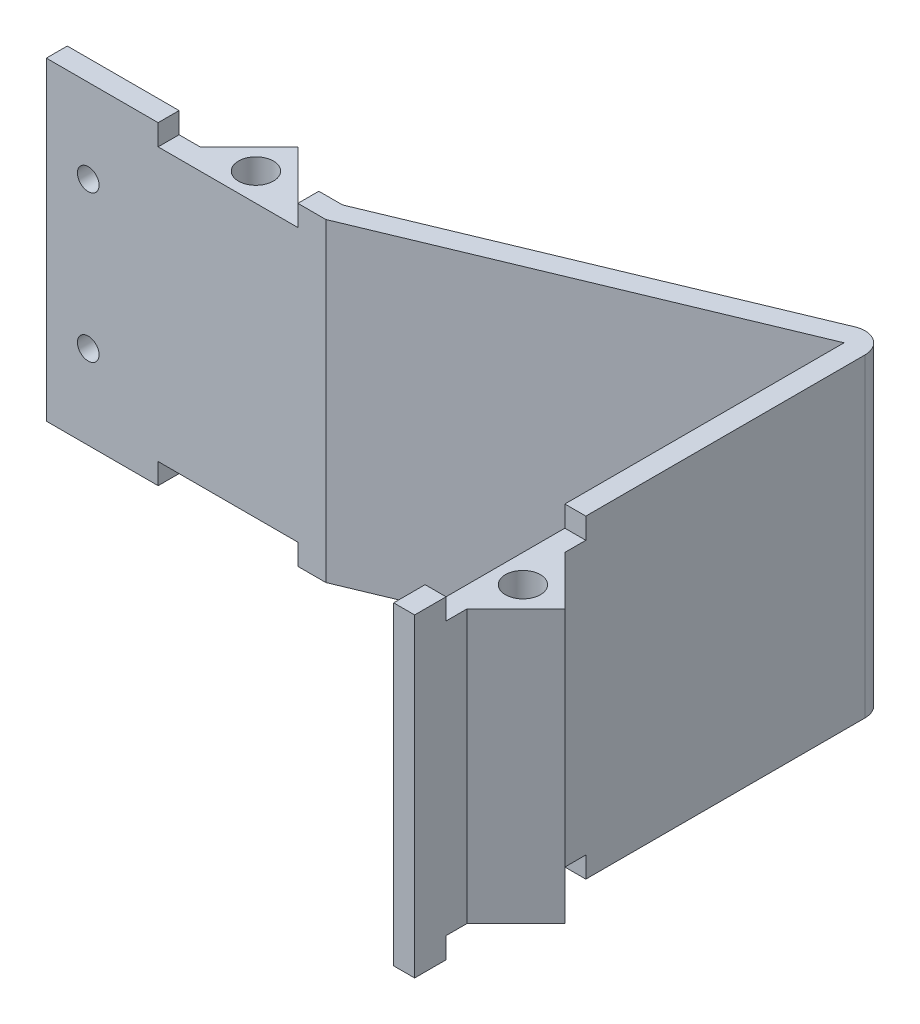
ISO-10303-21;
HEADER;
FILE_DESCRIPTION(('STEP AP214'),'2;1');
FILE_NAME('part.step','',(''),(''),'','','');
FILE_SCHEMA(('AUTOMOTIVE_DESIGN { 1 0 10303 214 1 1 1 1 }'));
ENDSEC;
DATA;
#1=APPLICATION_CONTEXT('core data for automotive mechanical design processes');
#2=APPLICATION_PROTOCOL_DEFINITION('international standard','automotive_design',2000,#1);
#3=PRODUCT_CONTEXT('',#1,'mechanical');
#4=PRODUCT('Part','Part','',(#3));
#5=PRODUCT_RELATED_PRODUCT_CATEGORY('part','',(#4));
#6=PRODUCT_DEFINITION_FORMATION('','',#4);
#7=PRODUCT_DEFINITION_CONTEXT('part definition',#1,'design');
#8=PRODUCT_DEFINITION('design','',#6,#7);
#9=PRODUCT_DEFINITION_SHAPE('','',#8);
#10=(LENGTH_UNIT() NAMED_UNIT(*) SI_UNIT(.MILLI.,.METRE.));
#11=(NAMED_UNIT(*) PLANE_ANGLE_UNIT() SI_UNIT($,.RADIAN.));
#12=(NAMED_UNIT(*) SI_UNIT($,.STERADIAN.) SOLID_ANGLE_UNIT());
#13=UNCERTAINTY_MEASURE_WITH_UNIT(LENGTH_MEASURE(1.E-05),#10,'distance_accuracy_value','');
#14=(GEOMETRIC_REPRESENTATION_CONTEXT(3) GLOBAL_UNCERTAINTY_ASSIGNED_CONTEXT((#13)) GLOBAL_UNIT_ASSIGNED_CONTEXT((#10,
#11,#12)) REPRESENTATION_CONTEXT('',''));
#15=CARTESIAN_POINT('',(0.,0.,0.));
#16=DIRECTION('',(0.,0.,1.));
#17=DIRECTION('',(1.,0.,0.));
#18=AXIS2_PLACEMENT_3D('',#15,#16,#17);
#19=CARTESIAN_POINT('',(95.37,0.,-18.8));
#20=DIRECTION('',(1.,0.,0.));
#21=DIRECTION('',(0.,0.,-1.));
#22=AXIS2_PLACEMENT_3D('',#19,#20,#21);
#23=PLANE('',#22);
#24=DIRECTION('',(0.,1.,0.));
#25=VECTOR('',#24,1.);
#26=CARTESIAN_POINT('',(95.37,0.,24.16));
#27=LINE('',#26,#25);
#28=CARTESIAN_POINT('',(95.37,3.,24.16));
#29=VERTEX_POINT('',#28);
#30=CARTESIAN_POINT('',(95.37,42.,24.16));
#31=VERTEX_POINT('',#30);
#32=EDGE_CURVE('E279',#29,#31,#27,.T.);
#33=ORIENTED_EDGE('',*,*,#32,.F.);
#34=DIRECTION('',(0.,0.,1.));
#35=VECTOR('',#34,1.);
#36=CARTESIAN_POINT('',(95.37,3.,41.16));
#37=LINE('',#36,#35);
#38=CARTESIAN_POINT('',(95.37,3.,21.16));
#39=VERTEX_POINT('',#38);
#40=EDGE_CURVE('E271',#39,#29,#37,.T.);
#41=ORIENTED_EDGE('',*,*,#40,.F.);
#42=DIRECTION('',(0.,1.,0.));
#43=VECTOR('',#42,1.);
#44=CARTESIAN_POINT('',(95.37,0.,21.16));
#45=LINE('',#44,#43);
#46=CARTESIAN_POINT('',(95.37,0.,21.16));
#47=VERTEX_POINT('',#46);
#48=EDGE_CURVE('E293',#47,#39,#45,.T.);
#49=ORIENTED_EDGE('',*,*,#48,.F.);
#50=DIRECTION('',(0.,0.,-1.));
#51=VECTOR('',#50,1.);
#52=CARTESIAN_POINT('',(95.37,0.,-18.8));
#53=LINE('',#52,#51);
#54=CARTESIAN_POINT('',(95.37,0.,-18.8));
#55=VERTEX_POINT('',#54);
#56=EDGE_CURVE('E341',#47,#55,#53,.T.);
#57=ORIENTED_EDGE('',*,*,#56,.T.);
#58=DIRECTION('',(0.,1.,0.));
#59=VECTOR('',#58,1.);
#60=CARTESIAN_POINT('',(95.37,0.,-18.8));
#61=LINE('',#60,#59);
#62=CARTESIAN_POINT('',(95.37,45.,-18.8));
#63=VERTEX_POINT('',#62);
#64=EDGE_CURVE('E361',#55,#63,#61,.T.);
#65=ORIENTED_EDGE('',*,*,#64,.T.);
#66=DIRECTION('',(0.,0.,-1.));
#67=VECTOR('',#66,1.);
#68=CARTESIAN_POINT('',(95.37,45.,-18.8));
#69=LINE('',#68,#67);
#70=CARTESIAN_POINT('',(95.37,45.,21.16));
#71=VERTEX_POINT('',#70);
#72=EDGE_CURVE('E354',#71,#63,#69,.T.);
#73=ORIENTED_EDGE('',*,*,#72,.F.);
#74=DIRECTION('',(0.,1.,0.));
#75=VECTOR('',#74,1.);
#76=CARTESIAN_POINT('',(95.37,45.,21.16));
#77=LINE('',#76,#75);
#78=CARTESIAN_POINT('',(95.37,42.,21.16));
#79=VERTEX_POINT('',#78);
#80=EDGE_CURVE('E313',#79,#71,#77,.T.);
#81=ORIENTED_EDGE('',*,*,#80,.F.);
#82=DIRECTION('',(0.,0.,-1.));
#83=VECTOR('',#82,1.);
#84=CARTESIAN_POINT('',(95.37,42.,41.16));
#85=LINE('',#84,#83);
#86=EDGE_CURVE('E321',#31,#79,#85,.T.);
#87=ORIENTED_EDGE('',*,*,#86,.F.);
#88=EDGE_LOOP('',(#33,#41,#49,#57,#65,#73,#81,#87));
#89=FACE_BOUND('',#88,.T.);
#90=ADVANCED_FACE('F50',(#89),#23,.T.);
#91=CARTESIAN_POINT('',(0.,0.,3.));
#92=DIRECTION('',(0.,1.,0.));
#93=DIRECTION('',(0.,0.,1.));
#94=AXIS2_PLACEMENT_3D('',#91,#92,#93);
#95=PLANE('',#94);
#96=DIRECTION('',(0.,0.,1.));
#97=VECTOR('',#96,1.);
#98=CARTESIAN_POINT('',(92.37,0.,-18.8));
#99=LINE('',#98,#97);
#100=CARTESIAN_POINT('',(92.37,0.,41.16));
#101=VERTEX_POINT('',#100);
#102=CARTESIAN_POINT('',(92.37,0.,45.66));
#103=VERTEX_POINT('',#102);
#104=EDGE_CURVE('E338',#101,#103,#99,.T.);
#105=ORIENTED_EDGE('',*,*,#104,.F.);
#106=DIRECTION('',(1.,0.,0.));
#107=VECTOR('',#106,1.);
#108=CARTESIAN_POINT('',(92.37,0.,41.16));
#109=LINE('',#108,#107);
#110=CARTESIAN_POINT('',(95.37,0.,41.16));
#111=VERTEX_POINT('',#110);
#112=EDGE_CURVE('E290',#101,#111,#109,.T.);
#113=ORIENTED_EDGE('',*,*,#112,.T.);
#114=CARTESIAN_POINT('',(95.37,0.,45.66));
#115=VERTEX_POINT('',#114);
#116=EDGE_CURVE('E342',#115,#111,#53,.T.);
#117=ORIENTED_EDGE('',*,*,#116,.F.);
#118=DIRECTION('',(1.,0.,0.));
#119=VECTOR('',#118,1.);
#120=CARTESIAN_POINT('',(92.37,0.,45.66));
#121=LINE('',#120,#119);
#122=EDGE_CURVE('E337',#103,#115,#121,.T.);
#123=ORIENTED_EDGE('',*,*,#122,.F.);
#124=EDGE_LOOP('',(#105,#113,#117,#123));
#125=FACE_BOUND('',#124,.T.);
#126=ADVANCED_FACE('F590',(#125),#95,.F.);
#127=CARTESIAN_POINT('',(0.,45.,3.));
#128=DIRECTION('',(0.,-1.,0.));
#129=DIRECTION('',(0.,0.,-1.));
#130=AXIS2_PLACEMENT_3D('',#127,#128,#129);
#131=PLANE('',#130);
#132=CARTESIAN_POINT('',(95.37,45.,45.66));
#133=VERTEX_POINT('',#132);
#134=CARTESIAN_POINT('',(95.37,45.,41.16));
#135=VERTEX_POINT('',#134);
#136=EDGE_CURVE('E355',#133,#135,#69,.T.);
#137=ORIENTED_EDGE('',*,*,#136,.T.);
#138=DIRECTION('',(1.,0.,0.));
#139=VECTOR('',#138,1.);
#140=CARTESIAN_POINT('',(92.37,45.,41.16));
#141=LINE('',#140,#139);
#142=CARTESIAN_POINT('',(92.37,45.,41.16));
#143=VERTEX_POINT('',#142);
#144=EDGE_CURVE('E294',#143,#135,#141,.T.);
#145=ORIENTED_EDGE('',*,*,#144,.F.);
#146=DIRECTION('',(0.,0.,1.));
#147=VECTOR('',#146,1.);
#148=CARTESIAN_POINT('',(92.37,45.,-18.8));
#149=LINE('',#148,#147);
#150=CARTESIAN_POINT('',(92.37,45.,45.66));
#151=VERTEX_POINT('',#150);
#152=EDGE_CURVE('E302',#143,#151,#149,.T.);
#153=ORIENTED_EDGE('',*,*,#152,.T.);
#154=DIRECTION('',(1.,0.,0.));
#155=VECTOR('',#154,1.);
#156=CARTESIAN_POINT('',(92.37,45.,45.66));
#157=LINE('',#156,#155);
#158=EDGE_CURVE('E351',#151,#133,#157,.T.);
#159=ORIENTED_EDGE('',*,*,#158,.T.);
#160=EDGE_LOOP('',(#137,#145,#153,#159));
#161=FACE_BOUND('',#160,.T.);
#162=ADVANCED_FACE('F596',(#161),#131,.F.);
#163=CARTESIAN_POINT('',(0.,0.,0.));
#164=DIRECTION('',(0.,0.,-1.));
#165=DIRECTION('',(-1.,0.,0.));
#166=AXIS2_PLACEMENT_3D('',#163,#164,#165);
#167=PLANE('',#166);
#168=CARTESIAN_POINT('',(6.,33.,0.));
#169=DIRECTION('',(0.,0.,-1.));
#170=DIRECTION('',(-1.,0.,0.));
#171=AXIS2_PLACEMENT_3D('',#168,#169,#170);
#172=CIRCLE('',#171,1.55);
#173=CARTESIAN_POINT('',(4.45,33.,0.));
#174=VERTEX_POINT('',#173);
#175=EDGE_CURVE('E964',#174,#174,#172,.T.);
#176=ORIENTED_EDGE('',*,*,#175,.F.);
#177=EDGE_LOOP('',(#176));
#178=FACE_BOUND('',#177,.T.);
#179=CARTESIAN_POINT('',(6.,12.,0.));
#180=DIRECTION('',(0.,0.,-1.));
#181=DIRECTION('',(1.,0.,0.));
#182=AXIS2_PLACEMENT_3D('',#179,#180,#181);
#183=CIRCLE('',#182,1.55);
#184=CARTESIAN_POINT('',(7.55,12.,0.));
#185=VERTEX_POINT('',#184);
#186=EDGE_CURVE('E974',#185,#185,#183,.T.);
#187=ORIENTED_EDGE('',*,*,#186,.F.);
#188=EDGE_LOOP('',(#187));
#189=FACE_BOUND('',#188,.T.);
#190=DIRECTION('',(1.,0.,0.));
#191=VECTOR('',#190,1.);
#192=CARTESIAN_POINT('',(16.,42.,0.));
#193=LINE('',#192,#191);
#194=CARTESIAN_POINT('',(16.,42.,0.));
#195=VERTEX_POINT('',#194);
#196=CARTESIAN_POINT('',(19.,42.,0.));
#197=VERTEX_POINT('',#196);
#198=EDGE_CURVE('E448',#195,#197,#193,.T.);
#199=ORIENTED_EDGE('',*,*,#198,.T.);
#200=DIRECTION('',(0.,-1.,0.));
#201=VECTOR('',#200,1.);
#202=CARTESIAN_POINT('',(19.,42.,0.));
#203=LINE('',#202,#201);
#204=CARTESIAN_POINT('',(19.,2.99999999999999,0.));
#205=VERTEX_POINT('',#204);
#206=EDGE_CURVE('E411',#197,#205,#203,.T.);
#207=ORIENTED_EDGE('',*,*,#206,.T.);
#208=DIRECTION('',(-1.,0.,0.));
#209=VECTOR('',#208,1.);
#210=CARTESIAN_POINT('',(16.,2.99999999999999,0.));
#211=LINE('',#210,#209);
#212=CARTESIAN_POINT('',(16.,2.99999999999999,0.));
#213=VERTEX_POINT('',#212);
#214=EDGE_CURVE('E422',#205,#213,#211,.T.);
#215=ORIENTED_EDGE('',*,*,#214,.T.);
#216=DIRECTION('',(0.,-1.,0.));
#217=VECTOR('',#216,1.);
#218=CARTESIAN_POINT('',(16.,2.99999999999999,0.));
#219=LINE('',#218,#217);
#220=CARTESIAN_POINT('',(16.,0.,0.));
#221=VERTEX_POINT('',#220);
#222=EDGE_CURVE('E415',#213,#221,#219,.T.);
#223=ORIENTED_EDGE('',*,*,#222,.T.);
#224=DIRECTION('',(1.,0.,0.));
#225=VECTOR('',#224,1.);
#226=CARTESIAN_POINT('',(0.,0.,0.));
#227=LINE('',#226,#225);
#228=CARTESIAN_POINT('',(0.,0.,0.));
#229=VERTEX_POINT('',#228);
#230=EDGE_CURVE('E482',#229,#221,#227,.T.);
#231=ORIENTED_EDGE('',*,*,#230,.F.);
#232=DIRECTION('',(0.,-1.,0.));
#233=VECTOR('',#232,1.);
#234=CARTESIAN_POINT('',(0.,0.,0.));
#235=LINE('',#234,#233);
#236=CARTESIAN_POINT('',(0.,45.,0.));
#237=VERTEX_POINT('',#236);
#238=EDGE_CURVE('E435',#237,#229,#235,.T.);
#239=ORIENTED_EDGE('',*,*,#238,.F.);
#240=DIRECTION('',(-1.,0.,0.));
#241=VECTOR('',#240,1.);
#242=CARTESIAN_POINT('',(0.,45.,0.));
#243=LINE('',#242,#241);
#244=CARTESIAN_POINT('',(16.,45.,0.));
#245=VERTEX_POINT('',#244);
#246=EDGE_CURVE('E485',#245,#237,#243,.T.);
#247=ORIENTED_EDGE('',*,*,#246,.F.);
#248=DIRECTION('',(0.,-1.,0.));
#249=VECTOR('',#248,1.);
#250=CARTESIAN_POINT('',(16.,42.,0.));
#251=LINE('',#250,#249);
#252=EDGE_CURVE('E443',#245,#195,#251,.T.);
#253=ORIENTED_EDGE('',*,*,#252,.T.);
#254=EDGE_LOOP('',(#199,#207,#215,#223,#231,#239,#247,#253));
#255=FACE_BOUND('',#254,.T.);
#256=ADVANCED_FACE('F500',(#178,#189,#255),#167,.T.);
#257=ORIENTED_EDGE('',*,*,#230,.T.);
#258=DIRECTION('',(0.,0.,1.));
#259=VECTOR('',#258,1.);
#260=CARTESIAN_POINT('',(16.,0.,0.));
#261=LINE('',#260,#259);
#262=CARTESIAN_POINT('',(16.,0.,3.));
#263=VERTEX_POINT('',#262);
#264=EDGE_CURVE('E426',#221,#263,#261,.T.);
#265=ORIENTED_EDGE('',*,*,#264,.T.);
#266=DIRECTION('',(1.,0.,0.));
#267=VECTOR('',#266,1.);
#268=CARTESIAN_POINT('',(0.,0.,3.));
#269=LINE('',#268,#267);
#270=CARTESIAN_POINT('',(0.,0.,3.));
#271=VERTEX_POINT('',#270);
#272=EDGE_CURVE('E472',#271,#263,#269,.T.);
#273=ORIENTED_EDGE('',*,*,#272,.F.);
#274=DIRECTION('',(0.,0.,-1.));
#275=VECTOR('',#274,1.);
#276=CARTESIAN_POINT('',(0.,0.,3.));
#277=LINE('',#276,#275);
#278=EDGE_CURVE('E59',#271,#229,#277,.T.);
#279=ORIENTED_EDGE('',*,*,#278,.T.);
#280=EDGE_LOOP('',(#257,#265,#273,#279));
#281=FACE_BOUND('',#280,.T.);
#282=ADVANCED_FACE('F493',(#281),#95,.F.);
#283=DIRECTION('',(-1.,0.,0.));
#284=VECTOR('',#283,1.);
#285=CARTESIAN_POINT('',(0.,45.,3.));
#286=LINE('',#285,#284);
#287=CARTESIAN_POINT('',(16.,45.,3.));
#288=VERTEX_POINT('',#287);
#289=CARTESIAN_POINT('',(0.,45.,3.));
#290=VERTEX_POINT('',#289);
#291=EDGE_CURVE('E475',#288,#290,#286,.T.);
#292=ORIENTED_EDGE('',*,*,#291,.F.);
#293=DIRECTION('',(0.,0.,1.));
#294=VECTOR('',#293,1.);
#295=CARTESIAN_POINT('',(16.,45.,0.));
#296=LINE('',#295,#294);
#297=EDGE_CURVE('E429',#245,#288,#296,.T.);
#298=ORIENTED_EDGE('',*,*,#297,.F.);
#299=ORIENTED_EDGE('',*,*,#246,.T.);
#300=DIRECTION('',(0.,0.,-1.));
#301=VECTOR('',#300,1.);
#302=CARTESIAN_POINT('',(0.,45.,3.));
#303=LINE('',#302,#301);
#304=EDGE_CURVE('E478',#290,#237,#303,.T.);
#305=ORIENTED_EDGE('',*,*,#304,.F.);
#306=EDGE_LOOP('',(#292,#298,#299,#305));
#307=FACE_BOUND('',#306,.T.);
#308=ADVANCED_FACE('F514',(#307),#131,.F.);
#309=CARTESIAN_POINT('',(0.,0.,3.));
#310=DIRECTION('',(0.,0.,-1.));
#311=DIRECTION('',(-1.,0.,0.));
#312=AXIS2_PLACEMENT_3D('',#309,#310,#311);
#313=PLANE('',#312);
#314=CARTESIAN_POINT('',(6.,33.,3.));
#315=DIRECTION('',(0.,0.,-1.));
#316=DIRECTION('',(-1.,0.,0.));
#317=AXIS2_PLACEMENT_3D('',#314,#315,#316);
#318=CIRCLE('',#317,1.55);
#319=CARTESIAN_POINT('',(4.45,33.,3.));
#320=VERTEX_POINT('',#319);
#321=EDGE_CURVE('E967',#320,#320,#318,.F.);
#322=ORIENTED_EDGE('',*,*,#321,.F.);
#323=EDGE_LOOP('',(#322));
#324=FACE_BOUND('',#323,.T.);
#325=CARTESIAN_POINT('',(6.,12.,3.));
#326=DIRECTION('',(0.,0.,-1.));
#327=DIRECTION('',(-1.,0.,0.));
#328=AXIS2_PLACEMENT_3D('',#325,#326,#327);
#329=CIRCLE('',#328,1.55);
#330=CARTESIAN_POINT('',(4.44999999999999,12.,3.));
#331=VERTEX_POINT('',#330);
#332=EDGE_CURVE('E971',#331,#331,#329,.F.);
#333=ORIENTED_EDGE('',*,*,#332,.F.);
#334=EDGE_LOOP('',(#333));
#335=FACE_BOUND('',#334,.T.);
#336=CARTESIAN_POINT('',(36.,0.,3.));
#337=VERTEX_POINT('',#336);
#338=CARTESIAN_POINT('',(40.,0.,3.));
#339=VERTEX_POINT('',#338);
#340=EDGE_CURVE('E470',#337,#339,#269,.T.);
#341=ORIENTED_EDGE('',*,*,#340,.T.);
#342=DIRECTION('',(0.,-1.,0.));
#343=VECTOR('',#342,1.);
#344=CARTESIAN_POINT('',(40.,45.,3.));
#345=LINE('',#344,#343);
#346=CARTESIAN_POINT('',(40.,45.,3.));
#347=VERTEX_POINT('',#346);
#348=EDGE_CURVE('E382',#347,#339,#345,.T.);
#349=ORIENTED_EDGE('',*,*,#348,.F.);
#350=CARTESIAN_POINT('',(36.,45.,3.));
#351=VERTEX_POINT('',#350);
#352=EDGE_CURVE('E476',#347,#351,#286,.T.);
#353=ORIENTED_EDGE('',*,*,#352,.T.);
#354=DIRECTION('',(0.,1.,0.));
#355=VECTOR('',#354,1.);
#356=CARTESIAN_POINT('',(36.,42.,3.));
#357=LINE('',#356,#355);
#358=CARTESIAN_POINT('',(36.,42.,3.));
#359=VERTEX_POINT('',#358);
#360=EDGE_CURVE('E447',#359,#351,#357,.T.);
#361=ORIENTED_EDGE('',*,*,#360,.F.);
#362=DIRECTION('',(1.,0.,0.));
#363=VECTOR('',#362,1.);
#364=CARTESIAN_POINT('',(0.,42.,3.));
#365=LINE('',#364,#363);
#366=CARTESIAN_POINT('',(16.,42.,3.));
#367=VERTEX_POINT('',#366);
#368=EDGE_CURVE('E388',#367,#359,#365,.T.);
#369=ORIENTED_EDGE('',*,*,#368,.F.);
#370=DIRECTION('',(0.,-1.,0.));
#371=VECTOR('',#370,1.);
#372=CARTESIAN_POINT('',(16.,42.,3.));
#373=LINE('',#372,#371);
#374=EDGE_CURVE('E410',#288,#367,#373,.T.);
#375=ORIENTED_EDGE('',*,*,#374,.F.);
#376=ORIENTED_EDGE('',*,*,#291,.T.);
#377=DIRECTION('',(0.,-1.,0.));
#378=VECTOR('',#377,1.);
#379=CARTESIAN_POINT('',(0.,0.,3.));
#380=LINE('',#379,#378);
#381=EDGE_CURVE('E468',#290,#271,#380,.T.);
#382=ORIENTED_EDGE('',*,*,#381,.T.);
#383=ORIENTED_EDGE('',*,*,#272,.T.);
#384=DIRECTION('',(0.,-1.,0.));
#385=VECTOR('',#384,1.);
#386=CARTESIAN_POINT('',(16.,2.99999999999999,3.));
#387=LINE('',#386,#385);
#388=CARTESIAN_POINT('',(16.,3.00000000000001,3.));
#389=VERTEX_POINT('',#388);
#390=EDGE_CURVE('E427',#389,#263,#387,.T.);
#391=ORIENTED_EDGE('',*,*,#390,.F.);
#392=DIRECTION('',(1.,0.,0.));
#393=VECTOR('',#392,1.);
#394=CARTESIAN_POINT('',(0.,3.00000000000002,3.));
#395=LINE('',#394,#393);
#396=CARTESIAN_POINT('',(36.,3.,3.));
#397=VERTEX_POINT('',#396);
#398=EDGE_CURVE('E386',#389,#397,#395,.T.);
#399=ORIENTED_EDGE('',*,*,#398,.T.);
#400=DIRECTION('',(0.,1.,0.));
#401=VECTOR('',#400,1.);
#402=CARTESIAN_POINT('',(36.,2.99999999999999,3.));
#403=LINE('',#402,#401);
#404=EDGE_CURVE('E419',#337,#397,#403,.T.);
#405=ORIENTED_EDGE('',*,*,#404,.F.);
#406=EDGE_LOOP('',(#341,#349,#353,#361,#369,#375,#376,#382,#383,#391,#399,#405));
#407=FACE_BOUND('',#406,.T.);
#408=ADVANCED_FACE('F509',(#324,#335,#407),#313,.F.);
#409=CARTESIAN_POINT('',(0.,0.,3.));
#410=DIRECTION('',(1.,0.,0.));
#411=DIRECTION('',(0.,0.,-1.));
#412=AXIS2_PLACEMENT_3D('',#409,#410,#411);
#413=PLANE('',#412);
#414=ORIENTED_EDGE('',*,*,#278,.F.);
#415=ORIENTED_EDGE('',*,*,#381,.F.);
#416=ORIENTED_EDGE('',*,*,#304,.T.);
#417=ORIENTED_EDGE('',*,*,#238,.T.);
#418=EDGE_LOOP('',(#414,#415,#416,#417));
#419=FACE_BOUND('',#418,.T.);
#420=ADVANCED_FACE('F52',(#419),#413,.F.);
#421=ORIENTED_EDGE('',*,*,#56,.F.);
#422=DIRECTION('',(1.,0.,0.));
#423=VECTOR('',#422,1.);
#424=CARTESIAN_POINT('',(92.37,0.,21.16));
#425=LINE('',#424,#423);
#426=CARTESIAN_POINT('',(92.37,0.,21.16));
#427=VERTEX_POINT('',#426);
#428=EDGE_CURVE('E305',#427,#47,#425,.T.);
#429=ORIENTED_EDGE('',*,*,#428,.F.);
#430=CARTESIAN_POINT('',(92.37,0.,-18.8));
#431=VERTEX_POINT('',#430);
#432=EDGE_CURVE('E334',#431,#427,#99,.T.);
#433=ORIENTED_EDGE('',*,*,#432,.F.);
#434=DIRECTION('',(0.923207258730021,0.,-0.384302429641292));
#435=VECTOR('',#434,1.);
#436=CARTESIAN_POINT('',(40.,0.,3.));
#437=LINE('',#436,#435);
#438=EDGE_CURVE('E369',#339,#431,#437,.T.);
#439=ORIENTED_EDGE('',*,*,#438,.F.);
#440=ORIENTED_EDGE('',*,*,#340,.F.);
#441=DIRECTION('',(0.,0.,1.));
#442=VECTOR('',#441,1.);
#443=CARTESIAN_POINT('',(36.,0.,0.));
#444=LINE('',#443,#442);
#445=CARTESIAN_POINT('',(36.,0.,0.));
#446=VERTEX_POINT('',#445);
#447=EDGE_CURVE('E439',#446,#337,#444,.T.);
#448=ORIENTED_EDGE('',*,*,#447,.F.);
#449=CARTESIAN_POINT('',(39.4005288386416,0.,0.));
#450=VERTEX_POINT('',#449);
#451=EDGE_CURVE('E481',#446,#450,#227,.T.);
#452=ORIENTED_EDGE('',*,*,#451,.T.);
#453=DIRECTION('',(-0.923207258730021,0.,0.384302429641292));
#454=VECTOR('',#453,1.);
#455=CARTESIAN_POINT('',(38.8470927110761,0.,0.230378223809936));
#456=LINE('',#455,#454);
#457=CARTESIAN_POINT('',(91.2170927110761,0.,-21.5696217761901));
#458=VERTEX_POINT('',#457);
#459=EDGE_CURVE('E372',#458,#450,#456,.T.);
#460=ORIENTED_EDGE('',*,*,#459,.F.);
#461=CARTESIAN_POINT('',(92.37,0.,-18.8));
#462=DIRECTION('',(0.,1.,0.));
#463=DIRECTION('',(0.,0.,1.));
#464=AXIS2_PLACEMENT_3D('',#461,#462,#463);
#465=CIRCLE('',#464,3.);
#466=EDGE_CURVE('E345',#55,#458,#465,.T.);
#467=ORIENTED_EDGE('',*,*,#466,.F.);
#468=EDGE_LOOP('',(#421,#429,#433,#439,#440,#448,#452,#460,#467));
#469=FACE_BOUND('',#468,.T.);
#470=ADVANCED_FACE('F538',(#469),#95,.F.);
#471=CARTESIAN_POINT('',(92.37,45.,-18.8));
#472=VERTEX_POINT('',#471);
#473=CARTESIAN_POINT('',(92.37,45.,21.16));
#474=VERTEX_POINT('',#473);
#475=EDGE_CURVE('E348',#472,#474,#149,.T.);
#476=ORIENTED_EDGE('',*,*,#475,.T.);
#477=DIRECTION('',(1.,0.,0.));
#478=VECTOR('',#477,1.);
#479=CARTESIAN_POINT('',(92.37,45.,21.16));
#480=LINE('',#479,#478);
#481=EDGE_CURVE('E327',#474,#71,#480,.T.);
#482=ORIENTED_EDGE('',*,*,#481,.T.);
#483=ORIENTED_EDGE('',*,*,#72,.T.);
#484=CARTESIAN_POINT('',(92.37,45.,-18.8));
#485=DIRECTION('',(0.,1.,0.));
#486=DIRECTION('',(0.,0.,1.));
#487=AXIS2_PLACEMENT_3D('',#484,#485,#486);
#488=CIRCLE('',#487,3.);
#489=CARTESIAN_POINT('',(91.2170927110761,45.,-21.5696217761901));
#490=VERTEX_POINT('',#489);
#491=EDGE_CURVE('E358',#63,#490,#488,.T.);
#492=ORIENTED_EDGE('',*,*,#491,.T.);
#493=DIRECTION('',(-0.923207258730021,0.,0.384302429641292));
#494=VECTOR('',#493,1.);
#495=CARTESIAN_POINT('',(38.8470927110761,45.,0.230378223809936));
#496=LINE('',#495,#494);
#497=CARTESIAN_POINT('',(39.4005288386416,45.,0.));
#498=VERTEX_POINT('',#497);
#499=EDGE_CURVE('E373',#490,#498,#496,.T.);
#500=ORIENTED_EDGE('',*,*,#499,.T.);
#501=CARTESIAN_POINT('',(36.,45.,0.));
#502=VERTEX_POINT('',#501);
#503=EDGE_CURVE('E471',#498,#502,#243,.T.);
#504=ORIENTED_EDGE('',*,*,#503,.T.);
#505=DIRECTION('',(0.,0.,1.));
#506=VECTOR('',#505,1.);
#507=CARTESIAN_POINT('',(36.,45.,0.));
#508=LINE('',#507,#506);
#509=EDGE_CURVE('E460',#502,#351,#508,.T.);
#510=ORIENTED_EDGE('',*,*,#509,.T.);
#511=ORIENTED_EDGE('',*,*,#352,.F.);
#512=DIRECTION('',(0.923207258730021,0.,-0.384302429641292));
#513=VECTOR('',#512,1.);
#514=CARTESIAN_POINT('',(40.,45.,3.));
#515=LINE('',#514,#513);
#516=EDGE_CURVE('E364',#347,#472,#515,.T.);
#517=ORIENTED_EDGE('',*,*,#516,.T.);
#518=EDGE_LOOP('',(#476,#482,#483,#492,#500,#504,#510,#511,#517));
#519=FACE_BOUND('',#518,.T.);
#520=ADVANCED_FACE('F550',(#519),#131,.F.);
#521=DIRECTION('',(0.,1.,0.));
#522=VECTOR('',#521,1.);
#523=CARTESIAN_POINT('',(39.4005288386416,0.,0.));
#524=LINE('',#523,#522);
#525=EDGE_CURVE('E13',#450,#498,#524,.T.);
#526=ORIENTED_EDGE('',*,*,#525,.F.);
#527=ORIENTED_EDGE('',*,*,#451,.F.);
#528=DIRECTION('',(0.,1.,0.));
#529=VECTOR('',#528,1.);
#530=CARTESIAN_POINT('',(36.,2.99999999999999,0.));
#531=LINE('',#530,#529);
#532=CARTESIAN_POINT('',(36.,2.99999999999999,0.));
#533=VERTEX_POINT('',#532);
#534=EDGE_CURVE('E418',#446,#533,#531,.T.);
#535=ORIENTED_EDGE('',*,*,#534,.T.);
#536=CARTESIAN_POINT('',(33.,3.,0.));
#537=VERTEX_POINT('',#536);
#538=EDGE_CURVE('E423',#533,#537,#211,.T.);
#539=ORIENTED_EDGE('',*,*,#538,.T.);
#540=DIRECTION('',(0.,-1.,0.));
#541=VECTOR('',#540,1.);
#542=CARTESIAN_POINT('',(33.,42.,0.));
#543=LINE('',#542,#541);
#544=CARTESIAN_POINT('',(33.,42.,0.));
#545=VERTEX_POINT('',#544);
#546=EDGE_CURVE('E403',#545,#537,#543,.T.);
#547=ORIENTED_EDGE('',*,*,#546,.F.);
#548=CARTESIAN_POINT('',(36.,42.,0.));
#549=VERTEX_POINT('',#548);
#550=EDGE_CURVE('E446',#545,#549,#193,.T.);
#551=ORIENTED_EDGE('',*,*,#550,.T.);
#552=DIRECTION('',(0.,1.,0.));
#553=VECTOR('',#552,1.);
#554=CARTESIAN_POINT('',(36.,42.,0.));
#555=LINE('',#554,#553);
#556=EDGE_CURVE('E451',#549,#502,#555,.T.);
#557=ORIENTED_EDGE('',*,*,#556,.T.);
#558=ORIENTED_EDGE('',*,*,#503,.F.);
#559=EDGE_LOOP('',(#526,#527,#535,#539,#547,#551,#557,#558));
#560=FACE_BOUND('',#559,.T.);
#561=ADVANCED_FACE('F543',(#560),#167,.T.);
#562=CARTESIAN_POINT('',(0.,42.,6.));
#563=DIRECTION('',(0.,-1.,0.));
#564=DIRECTION('',(0.,0.,-1.));
#565=AXIS2_PLACEMENT_3D('',#562,#563,#564);
#566=PLANE('',#565);
#567=CARTESIAN_POINT('',(26.,42.,-0.999999999999999));
#568=DIRECTION('',(0.,-1.,0.));
#569=DIRECTION('',(0.,0.,-1.));
#570=AXIS2_PLACEMENT_3D('',#567,#568,#569);
#571=CIRCLE('',#570,2.5);
#572=CARTESIAN_POINT('',(26.,42.,-3.5));
#573=VERTEX_POINT('',#572);
#574=EDGE_CURVE('E393',#573,#573,#571,.T.);
#575=ORIENTED_EDGE('',*,*,#574,.T.);
#576=EDGE_LOOP('',(#575));
#577=FACE_BOUND('',#576,.T.);
#578=DIRECTION('',(0.,0.,1.));
#579=VECTOR('',#578,1.);
#580=CARTESIAN_POINT('',(16.,42.,0.));
#581=LINE('',#580,#579);
#582=EDGE_CURVE('E454',#195,#367,#581,.T.);
#583=ORIENTED_EDGE('',*,*,#582,.T.);
#584=ORIENTED_EDGE('',*,*,#368,.T.);
#585=DIRECTION('',(0.,0.,1.));
#586=VECTOR('',#585,1.);
#587=CARTESIAN_POINT('',(36.,42.,0.));
#588=LINE('',#587,#586);
#589=EDGE_CURVE('E463',#549,#359,#588,.T.);
#590=ORIENTED_EDGE('',*,*,#589,.F.);
#591=ORIENTED_EDGE('',*,*,#550,.F.);
#592=DIRECTION('',(0.707106781186547,0.,0.707106781186548));
#593=VECTOR('',#592,1.);
#594=CARTESIAN_POINT('',(33.,42.,0.));
#595=LINE('',#594,#593);
#596=CARTESIAN_POINT('',(26.,42.,-7.));
#597=VERTEX_POINT('',#596);
#598=EDGE_CURVE('E397',#597,#545,#595,.T.);
#599=ORIENTED_EDGE('',*,*,#598,.F.);
#600=DIRECTION('',(0.707106781186548,0.,-0.707106781186547));
#601=VECTOR('',#600,1.);
#602=CARTESIAN_POINT('',(19.,42.,0.));
#603=LINE('',#602,#601);
#604=EDGE_CURVE('E399',#197,#597,#603,.T.);
#605=ORIENTED_EDGE('',*,*,#604,.F.);
#606=ORIENTED_EDGE('',*,*,#198,.F.);
#607=EDGE_LOOP('',(#583,#584,#590,#591,#599,#605,#606));
#608=FACE_BOUND('',#607,.T.);
#609=ADVANCED_FACE('F520',(#577,#608),#566,.F.);
#610=CARTESIAN_POINT('',(0.,3.00000000000002,6.));
#611=DIRECTION('',(0.,1.,0.));
#612=DIRECTION('',(-1.,0.,0.));
#613=AXIS2_PLACEMENT_3D('',#610,#611,#612);
#614=PLANE('',#613);
#615=CARTESIAN_POINT('',(26.,3.,-0.999999999999999));
#616=DIRECTION('',(0.,-1.,0.));
#617=DIRECTION('',(1.,0.,0.));
#618=AXIS2_PLACEMENT_3D('',#615,#616,#617);
#619=CIRCLE('',#618,2.5);
#620=CARTESIAN_POINT('',(28.5,3.,-0.999999999999999));
#621=VERTEX_POINT('',#620);
#622=EDGE_CURVE('E390',#621,#621,#619,.T.);
#623=ORIENTED_EDGE('',*,*,#622,.F.);
#624=EDGE_LOOP('',(#623));
#625=FACE_BOUND('',#624,.T.);
#626=DIRECTION('',(0.,0.,1.));
#627=VECTOR('',#626,1.);
#628=CARTESIAN_POINT('',(36.,2.99999999999999,0.));
#629=LINE('',#628,#627);
#630=EDGE_CURVE('E436',#533,#397,#629,.T.);
#631=ORIENTED_EDGE('',*,*,#630,.T.);
#632=ORIENTED_EDGE('',*,*,#398,.F.);
#633=DIRECTION('',(0.,0.,1.));
#634=VECTOR('',#633,1.);
#635=CARTESIAN_POINT('',(16.,2.99999999999999,0.));
#636=LINE('',#635,#634);
#637=EDGE_CURVE('E432',#213,#389,#636,.T.);
#638=ORIENTED_EDGE('',*,*,#637,.F.);
#639=ORIENTED_EDGE('',*,*,#214,.F.);
#640=DIRECTION('',(0.707106781186548,0.,-0.707106781186547));
#641=VECTOR('',#640,1.);
#642=CARTESIAN_POINT('',(19.,3.00000000000001,0.));
#643=LINE('',#642,#641);
#644=CARTESIAN_POINT('',(26.,3.,-7.));
#645=VERTEX_POINT('',#644);
#646=EDGE_CURVE('E400',#205,#645,#643,.T.);
#647=ORIENTED_EDGE('',*,*,#646,.T.);
#648=DIRECTION('',(0.707106781186547,0.,0.707106781186548));
#649=VECTOR('',#648,1.);
#650=CARTESIAN_POINT('',(33.,3.,0.));
#651=LINE('',#650,#649);
#652=EDGE_CURVE('E396',#645,#537,#651,.T.);
#653=ORIENTED_EDGE('',*,*,#652,.T.);
#654=ORIENTED_EDGE('',*,*,#538,.F.);
#655=EDGE_LOOP('',(#631,#632,#638,#639,#647,#653,#654));
#656=FACE_BOUND('',#655,.T.);
#657=ADVANCED_FACE('F527',(#625,#656),#614,.F.);
#658=CARTESIAN_POINT('',(16.,2.99999999999999,0.));
#659=DIRECTION('',(-1.,0.,0.));
#660=DIRECTION('',(0.,0.,1.));
#661=AXIS2_PLACEMENT_3D('',#658,#659,#660);
#662=PLANE('',#661);
#663=ORIENTED_EDGE('',*,*,#390,.T.);
#664=ORIENTED_EDGE('',*,*,#264,.F.);
#665=ORIENTED_EDGE('',*,*,#222,.F.);
#666=ORIENTED_EDGE('',*,*,#637,.T.);
#667=EDGE_LOOP('',(#663,#664,#665,#666));
#668=FACE_BOUND('',#667,.T.);
#669=ADVANCED_FACE('F505',(#668),#662,.F.);
#670=CARTESIAN_POINT('',(36.,2.99999999999999,0.));
#671=DIRECTION('',(1.,0.,0.));
#672=DIRECTION('',(0.,0.,-1.));
#673=AXIS2_PLACEMENT_3D('',#670,#671,#672);
#674=PLANE('',#673);
#675=ORIENTED_EDGE('',*,*,#404,.T.);
#676=ORIENTED_EDGE('',*,*,#630,.F.);
#677=ORIENTED_EDGE('',*,*,#534,.F.);
#678=ORIENTED_EDGE('',*,*,#447,.T.);
#679=EDGE_LOOP('',(#675,#676,#677,#678));
#680=FACE_BOUND('',#679,.T.);
#681=ADVANCED_FACE('F532',(#680),#674,.F.);
#682=CARTESIAN_POINT('',(16.,42.,0.));
#683=DIRECTION('',(-1.,0.,0.));
#684=DIRECTION('',(0.,0.,1.));
#685=AXIS2_PLACEMENT_3D('',#682,#683,#684);
#686=PLANE('',#685);
#687=ORIENTED_EDGE('',*,*,#374,.T.);
#688=ORIENTED_EDGE('',*,*,#582,.F.);
#689=ORIENTED_EDGE('',*,*,#252,.F.);
#690=ORIENTED_EDGE('',*,*,#297,.T.);
#691=EDGE_LOOP('',(#687,#688,#689,#690));
#692=FACE_BOUND('',#691,.T.);
#693=ADVANCED_FACE('F516',(#692),#686,.F.);
#694=CARTESIAN_POINT('',(36.,42.,0.));
#695=DIRECTION('',(1.,0.,0.));
#696=DIRECTION('',(0.,0.,-1.));
#697=AXIS2_PLACEMENT_3D('',#694,#695,#696);
#698=PLANE('',#697);
#699=ORIENTED_EDGE('',*,*,#360,.T.);
#700=ORIENTED_EDGE('',*,*,#509,.F.);
#701=ORIENTED_EDGE('',*,*,#556,.F.);
#702=ORIENTED_EDGE('',*,*,#589,.T.);
#703=EDGE_LOOP('',(#699,#700,#701,#702));
#704=FACE_BOUND('',#703,.T.);
#705=ADVANCED_FACE('F574',(#704),#698,.F.);
#706=CARTESIAN_POINT('',(33.,42.,0.));
#707=DIRECTION('',(0.707106781186548,0.,-0.707106781186547));
#708=DIRECTION('',(-0.707106781186547,0.,-0.707106781186548));
#709=AXIS2_PLACEMENT_3D('',#706,#707,#708);
#710=PLANE('',#709);
#711=ORIENTED_EDGE('',*,*,#652,.F.);
#712=DIRECTION('',(0.,-1.,0.));
#713=VECTOR('',#712,1.);
#714=CARTESIAN_POINT('',(26.,42.,-7.));
#715=LINE('',#714,#713);
#716=EDGE_CURVE('E408',#597,#645,#715,.T.);
#717=ORIENTED_EDGE('',*,*,#716,.F.);
#718=ORIENTED_EDGE('',*,*,#598,.T.);
#719=ORIENTED_EDGE('',*,*,#546,.T.);
#720=EDGE_LOOP('',(#711,#717,#718,#719));
#721=FACE_BOUND('',#720,.T.);
#722=ADVANCED_FACE('F578',(#721),#710,.T.);
#723=CARTESIAN_POINT('',(19.,42.,0.));
#724=DIRECTION('',(-0.707106781186547,0.,-0.707106781186548));
#725=DIRECTION('',(-0.707106781186548,0.,0.707106781186547));
#726=AXIS2_PLACEMENT_3D('',#723,#724,#725);
#727=PLANE('',#726);
#728=ORIENTED_EDGE('',*,*,#646,.F.);
#729=ORIENTED_EDGE('',*,*,#206,.F.);
#730=ORIENTED_EDGE('',*,*,#604,.T.);
#731=ORIENTED_EDGE('',*,*,#716,.T.);
#732=EDGE_LOOP('',(#728,#729,#730,#731));
#733=FACE_BOUND('',#732,.T.);
#734=ADVANCED_FACE('F524',(#733),#727,.T.);
#735=CARTESIAN_POINT('',(26.,45.,-0.999999999999999));
#736=DIRECTION('',(0.,-1.,0.));
#737=DIRECTION('',(1.,0.,0.));
#738=AXIS2_PLACEMENT_3D('',#735,#736,#737);
#739=CYLINDRICAL_SURFACE('',#738,2.5);
#740=ORIENTED_EDGE('',*,*,#622,.T.);
#741=EDGE_LOOP('',(#740));
#742=FACE_BOUND('',#741,.T.);
#743=ORIENTED_EDGE('',*,*,#574,.F.);
#744=EDGE_LOOP('',(#743));
#745=FACE_BOUND('',#744,.T.);
#746=ADVANCED_FACE('F585',(#742,#745),#739,.F.);
#747=CARTESIAN_POINT('',(38.8470927110761,0.,0.230378223809936));
#748=DIRECTION('',(-0.384302429641292,0.,-0.923207258730021));
#749=DIRECTION('',(-0.923207258730021,0.,0.384302429641292));
#750=AXIS2_PLACEMENT_3D('',#747,#748,#749);
#751=PLANE('',#750);
#752=ORIENTED_EDGE('',*,*,#459,.T.);
#753=ORIENTED_EDGE('',*,*,#525,.T.);
#754=ORIENTED_EDGE('',*,*,#499,.F.);
#755=DIRECTION('',(0.,1.,0.));
#756=VECTOR('',#755,1.);
#757=CARTESIAN_POINT('',(91.2170927110761,0.,-21.5696217761901));
#758=LINE('',#757,#756);
#759=EDGE_CURVE('E380',#458,#490,#758,.T.);
#760=ORIENTED_EDGE('',*,*,#759,.F.);
#761=EDGE_LOOP('',(#752,#753,#754,#760));
#762=FACE_BOUND('',#761,.T.);
#763=ADVANCED_FACE('F547',(#762),#751,.T.);
#764=CARTESIAN_POINT('',(40.,0.,3.));
#765=DIRECTION('',(0.384302429641292,0.,0.923207258730021));
#766=DIRECTION('',(0.923207258730021,0.,-0.384302429641292));
#767=AXIS2_PLACEMENT_3D('',#764,#765,#766);
#768=PLANE('',#767);
#769=ORIENTED_EDGE('',*,*,#516,.F.);
#770=ORIENTED_EDGE('',*,*,#348,.T.);
#771=ORIENTED_EDGE('',*,*,#438,.T.);
#772=DIRECTION('',(0.,1.,0.));
#773=VECTOR('',#772,1.);
#774=CARTESIAN_POINT('',(92.37,0.,-18.8));
#775=LINE('',#774,#773);
#776=EDGE_CURVE('E375',#431,#472,#775,.T.);
#777=ORIENTED_EDGE('',*,*,#776,.T.);
#778=EDGE_LOOP('',(#769,#770,#771,#777));
#779=FACE_BOUND('',#778,.T.);
#780=ADVANCED_FACE('F568',(#779),#768,.T.);
#781=CARTESIAN_POINT('',(92.37,0.,-18.8));
#782=DIRECTION('',(-1.,0.,0.));
#783=DIRECTION('',(0.,0.,1.));
#784=AXIS2_PLACEMENT_3D('',#781,#782,#783);
#785=PLANE('',#784);
#786=DIRECTION('',(0.,-1.,0.));
#787=VECTOR('',#786,1.);
#788=CARTESIAN_POINT('',(92.37,45.,41.16));
#789=LINE('',#788,#787);
#790=CARTESIAN_POINT('',(92.37,42.,41.16));
#791=VERTEX_POINT('',#790);
#792=EDGE_CURVE('E309',#143,#791,#789,.T.);
#793=ORIENTED_EDGE('',*,*,#792,.T.);
#794=DIRECTION('',(0.,0.,-1.));
#795=VECTOR('',#794,1.);
#796=CARTESIAN_POINT('',(92.37,42.,41.16));
#797=LINE('',#796,#795);
#798=CARTESIAN_POINT('',(92.37,42.,21.16));
#799=VERTEX_POINT('',#798);
#800=EDGE_CURVE('E312',#791,#799,#797,.T.);
#801=ORIENTED_EDGE('',*,*,#800,.T.);
#802=DIRECTION('',(0.,1.,0.));
#803=VECTOR('',#802,1.);
#804=CARTESIAN_POINT('',(92.37,45.,21.16));
#805=LINE('',#804,#803);
#806=EDGE_CURVE('E316',#799,#474,#805,.T.);
#807=ORIENTED_EDGE('',*,*,#806,.T.);
#808=ORIENTED_EDGE('',*,*,#475,.F.);
#809=ORIENTED_EDGE('',*,*,#776,.F.);
#810=ORIENTED_EDGE('',*,*,#432,.T.);
#811=DIRECTION('',(0.,1.,0.));
#812=VECTOR('',#811,1.);
#813=CARTESIAN_POINT('',(92.37,0.,21.16));
#814=LINE('',#813,#812);
#815=CARTESIAN_POINT('',(92.37,3.,21.16));
#816=VERTEX_POINT('',#815);
#817=EDGE_CURVE('E284',#427,#816,#814,.T.);
#818=ORIENTED_EDGE('',*,*,#817,.T.);
#819=DIRECTION('',(0.,0.,1.));
#820=VECTOR('',#819,1.);
#821=CARTESIAN_POINT('',(92.37,3.,41.16));
#822=LINE('',#821,#820);
#823=CARTESIAN_POINT('',(92.37,3.,41.16));
#824=VERTEX_POINT('',#823);
#825=EDGE_CURVE('E287',#816,#824,#822,.T.);
#826=ORIENTED_EDGE('',*,*,#825,.T.);
#827=DIRECTION('',(0.,-1.,0.));
#828=VECTOR('',#827,1.);
#829=CARTESIAN_POINT('',(92.37,0.,41.16));
#830=LINE('',#829,#828);
#831=EDGE_CURVE('E281',#824,#101,#830,.T.);
#832=ORIENTED_EDGE('',*,*,#831,.T.);
#833=ORIENTED_EDGE('',*,*,#104,.T.);
#834=DIRECTION('',(0.,1.,0.));
#835=VECTOR('',#834,1.);
#836=CARTESIAN_POINT('',(92.37,0.,45.66));
#837=LINE('',#836,#835);
#838=EDGE_CURVE('E347',#103,#151,#837,.T.);
#839=ORIENTED_EDGE('',*,*,#838,.T.);
#840=ORIENTED_EDGE('',*,*,#152,.F.);
#841=EDGE_LOOP('',(#793,#801,#807,#808,#809,#810,#818,#826,#832,#833,#839,#840));
#842=FACE_BOUND('',#841,.T.);
#843=ADVANCED_FACE('F566',(#842),#785,.T.);
#844=CARTESIAN_POINT('',(92.37,0.,-18.8));
#845=DIRECTION('',(0.,1.,0.));
#846=DIRECTION('',(0.,0.,1.));
#847=AXIS2_PLACEMENT_3D('',#844,#845,#846);
#848=CYLINDRICAL_SURFACE('',#847,3.);
#849=ORIENTED_EDGE('',*,*,#491,.F.);
#850=ORIENTED_EDGE('',*,*,#64,.F.);
#851=ORIENTED_EDGE('',*,*,#466,.T.);
#852=ORIENTED_EDGE('',*,*,#759,.T.);
#853=EDGE_LOOP('',(#849,#850,#851,#852));
#854=FACE_BOUND('',#853,.T.);
#855=ADVANCED_FACE('F556',(#854),#848,.T.);
#856=DIRECTION('',(0.,-1.,0.));
#857=VECTOR('',#856,1.);
#858=CARTESIAN_POINT('',(95.37,0.,38.16));
#859=LINE('',#858,#857);
#860=CARTESIAN_POINT('',(95.37,42.,38.16));
#861=VERTEX_POINT('',#860);
#862=CARTESIAN_POINT('',(95.37,3.,38.16));
#863=VERTEX_POINT('',#862);
#864=EDGE_CURVE('E258',#861,#863,#859,.T.);
#865=ORIENTED_EDGE('',*,*,#864,.F.);
#866=CARTESIAN_POINT('',(95.37,42.,41.16));
#867=VERTEX_POINT('',#866);
#868=EDGE_CURVE('E322',#867,#861,#85,.T.);
#869=ORIENTED_EDGE('',*,*,#868,.F.);
#870=DIRECTION('',(0.,-1.,0.));
#871=VECTOR('',#870,1.);
#872=CARTESIAN_POINT('',(95.37,45.,41.16));
#873=LINE('',#872,#871);
#874=EDGE_CURVE('E74',#135,#867,#873,.T.);
#875=ORIENTED_EDGE('',*,*,#874,.F.);
#876=ORIENTED_EDGE('',*,*,#136,.F.);
#877=DIRECTION('',(0.,1.,0.));
#878=VECTOR('',#877,1.);
#879=CARTESIAN_POINT('',(95.37,0.,45.66));
#880=LINE('',#879,#878);
#881=EDGE_CURVE('E365',#115,#133,#880,.T.);
#882=ORIENTED_EDGE('',*,*,#881,.F.);
#883=ORIENTED_EDGE('',*,*,#116,.T.);
#884=DIRECTION('',(0.,-1.,0.));
#885=VECTOR('',#884,1.);
#886=CARTESIAN_POINT('',(95.37,0.,41.16));
#887=LINE('',#886,#885);
#888=CARTESIAN_POINT('',(95.37,3.,41.16));
#889=VERTEX_POINT('',#888);
#890=EDGE_CURVE('E291',#889,#111,#887,.T.);
#891=ORIENTED_EDGE('',*,*,#890,.F.);
#892=EDGE_CURVE('E297',#863,#889,#37,.T.);
#893=ORIENTED_EDGE('',*,*,#892,.F.);
#894=EDGE_LOOP('',(#865,#869,#875,#876,#882,#883,#891,#893));
#895=FACE_BOUND('',#894,.T.);
#896=ADVANCED_FACE('F592',(#895),#23,.T.);
#897=CARTESIAN_POINT('',(92.37,0.,45.66));
#898=DIRECTION('',(0.,0.,1.));
#899=DIRECTION('',(1.,0.,0.));
#900=AXIS2_PLACEMENT_3D('',#897,#898,#899);
#901=PLANE('',#900);
#902=ORIENTED_EDGE('',*,*,#158,.F.);
#903=ORIENTED_EDGE('',*,*,#838,.F.);
#904=ORIENTED_EDGE('',*,*,#122,.T.);
#905=ORIENTED_EDGE('',*,*,#881,.T.);
#906=EDGE_LOOP('',(#902,#903,#904,#905));
#907=FACE_BOUND('',#906,.T.);
#908=ADVANCED_FACE('F601',(#907),#901,.T.);
#909=CARTESIAN_POINT('',(92.37,45.,41.16));
#910=DIRECTION('',(0.,0.,1.));
#911=DIRECTION('',(1.,0.,0.));
#912=AXIS2_PLACEMENT_3D('',#909,#910,#911);
#913=PLANE('',#912);
#914=ORIENTED_EDGE('',*,*,#874,.T.);
#915=DIRECTION('',(1.,0.,0.));
#916=VECTOR('',#915,1.);
#917=CARTESIAN_POINT('',(92.37,42.,41.16));
#918=LINE('',#917,#916);
#919=EDGE_CURVE('E319',#791,#867,#918,.T.);
#920=ORIENTED_EDGE('',*,*,#919,.F.);
#921=ORIENTED_EDGE('',*,*,#792,.F.);
#922=ORIENTED_EDGE('',*,*,#144,.T.);
#923=EDGE_LOOP('',(#914,#920,#921,#922));
#924=FACE_BOUND('',#923,.T.);
#925=ADVANCED_FACE('F607',(#924),#913,.F.);
#926=CARTESIAN_POINT('',(92.37,45.,21.16));
#927=DIRECTION('',(0.,0.,-1.));
#928=DIRECTION('',(-1.,0.,0.));
#929=AXIS2_PLACEMENT_3D('',#926,#927,#928);
#930=PLANE('',#929);
#931=ORIENTED_EDGE('',*,*,#80,.T.);
#932=ORIENTED_EDGE('',*,*,#481,.F.);
#933=ORIENTED_EDGE('',*,*,#806,.F.);
#934=DIRECTION('',(1.,0.,0.));
#935=VECTOR('',#934,1.);
#936=CARTESIAN_POINT('',(92.37,42.,21.16));
#937=LINE('',#936,#935);
#938=EDGE_CURVE('E330',#799,#79,#937,.T.);
#939=ORIENTED_EDGE('',*,*,#938,.T.);
#940=EDGE_LOOP('',(#931,#932,#933,#939));
#941=FACE_BOUND('',#940,.T.);
#942=ADVANCED_FACE('F633',(#941),#930,.F.);
#943=CARTESIAN_POINT('',(92.37,42.,41.16));
#944=DIRECTION('',(0.,-1.,0.));
#945=DIRECTION('',(0.,0.,-1.));
#946=AXIS2_PLACEMENT_3D('',#943,#944,#945);
#947=PLANE('',#946);
#948=CARTESIAN_POINT('',(96.37,42.,31.16));
#949=DIRECTION('',(0.,1.,0.));
#950=DIRECTION('',(0.,0.,1.));
#951=AXIS2_PLACEMENT_3D('',#948,#949,#950);
#952=CIRCLE('',#951,2.50000000000001);
#953=CARTESIAN_POINT('',(96.37,42.,33.66));
#954=VERTEX_POINT('',#953);
#955=EDGE_CURVE('E968',#954,#954,#952,.T.);
#956=ORIENTED_EDGE('',*,*,#955,.F.);
#957=EDGE_LOOP('',(#956));
#958=FACE_BOUND('',#957,.T.);
#959=ORIENTED_EDGE('',*,*,#868,.T.);
#960=DIRECTION('',(0.707106781186547,0.,-0.707106781186548));
#961=VECTOR('',#960,1.);
#962=CARTESIAN_POINT('',(92.37,42.,41.16));
#963=LINE('',#962,#961);
#964=CARTESIAN_POINT('',(102.37,42.,31.16));
#965=VERTEX_POINT('',#964);
#966=EDGE_CURVE('E275',#861,#965,#963,.T.);
#967=ORIENTED_EDGE('',*,*,#966,.T.);
#968=DIRECTION('',(-0.707106781186547,0.,-0.707106781186547));
#969=VECTOR('',#968,1.);
#970=CARTESIAN_POINT('',(92.37,42.,21.16));
#971=LINE('',#970,#969);
#972=EDGE_CURVE('E66',#965,#31,#971,.T.);
#973=ORIENTED_EDGE('',*,*,#972,.T.);
#974=ORIENTED_EDGE('',*,*,#86,.T.);
#975=ORIENTED_EDGE('',*,*,#938,.F.);
#976=ORIENTED_EDGE('',*,*,#800,.F.);
#977=ORIENTED_EDGE('',*,*,#919,.T.);
#978=EDGE_LOOP('',(#959,#967,#973,#974,#975,#976,#977));
#979=FACE_BOUND('',#978,.T.);
#980=ADVANCED_FACE('F611',(#958,#979),#947,.F.);
#981=CARTESIAN_POINT('',(92.37,0.,41.16));
#982=DIRECTION('',(0.,0.,1.));
#983=DIRECTION('',(1.,0.,0.));
#984=AXIS2_PLACEMENT_3D('',#981,#982,#983);
#985=PLANE('',#984);
#986=ORIENTED_EDGE('',*,*,#890,.T.);
#987=ORIENTED_EDGE('',*,*,#112,.F.);
#988=ORIENTED_EDGE('',*,*,#831,.F.);
#989=DIRECTION('',(1.,0.,0.));
#990=VECTOR('',#989,1.);
#991=CARTESIAN_POINT('',(92.37,3.,41.16));
#992=LINE('',#991,#990);
#993=EDGE_CURVE('E299',#824,#889,#992,.T.);
#994=ORIENTED_EDGE('',*,*,#993,.T.);
#995=EDGE_LOOP('',(#986,#987,#988,#994));
#996=FACE_BOUND('',#995,.T.);
#997=ADVANCED_FACE('F624',(#996),#985,.F.);
#998=CARTESIAN_POINT('',(92.37,3.,41.16));
#999=DIRECTION('',(0.,1.,0.));
#1000=DIRECTION('',(0.,0.,1.));
#1001=AXIS2_PLACEMENT_3D('',#998,#999,#1000);
#1002=PLANE('',#1001);
#1003=CARTESIAN_POINT('',(96.37,3.,31.16));
#1004=DIRECTION('',(0.,1.,0.));
#1005=DIRECTION('',(0.,0.,1.));
#1006=AXIS2_PLACEMENT_3D('',#1003,#1004,#1005);
#1007=CIRCLE('',#1006,2.50000000000001);
#1008=CARTESIAN_POINT('',(96.37,3.,33.66));
#1009=VERTEX_POINT('',#1008);
#1010=EDGE_CURVE('E54',#1009,#1009,#1007,.T.);
#1011=ORIENTED_EDGE('',*,*,#1010,.T.);
#1012=EDGE_LOOP('',(#1011));
#1013=FACE_BOUND('',#1012,.T.);
#1014=ORIENTED_EDGE('',*,*,#993,.F.);
#1015=ORIENTED_EDGE('',*,*,#825,.F.);
#1016=DIRECTION('',(1.,0.,0.));
#1017=VECTOR('',#1016,1.);
#1018=CARTESIAN_POINT('',(92.37,3.,21.16));
#1019=LINE('',#1018,#1017);
#1020=EDGE_CURVE('E303',#816,#39,#1019,.T.);
#1021=ORIENTED_EDGE('',*,*,#1020,.T.);
#1022=ORIENTED_EDGE('',*,*,#40,.T.);
#1023=DIRECTION('',(-0.707106781186547,0.,-0.707106781186547));
#1024=VECTOR('',#1023,1.);
#1025=CARTESIAN_POINT('',(92.37,3.,21.16));
#1026=LINE('',#1025,#1024);
#1027=CARTESIAN_POINT('',(102.37,3.,31.16));
#1028=VERTEX_POINT('',#1027);
#1029=EDGE_CURVE('E262',#1028,#29,#1026,.T.);
#1030=ORIENTED_EDGE('',*,*,#1029,.F.);
#1031=DIRECTION('',(0.707106781186547,0.,-0.707106781186548));
#1032=VECTOR('',#1031,1.);
#1033=CARTESIAN_POINT('',(92.37,3.,41.16));
#1034=LINE('',#1033,#1032);
#1035=EDGE_CURVE('E253',#863,#1028,#1034,.T.);
#1036=ORIENTED_EDGE('',*,*,#1035,.F.);
#1037=ORIENTED_EDGE('',*,*,#892,.T.);
#1038=EDGE_LOOP('',(#1014,#1015,#1021,#1022,#1030,#1036,#1037));
#1039=FACE_BOUND('',#1038,.T.);
#1040=ADVANCED_FACE('F269',(#1013,#1039),#1002,.F.);
#1041=CARTESIAN_POINT('',(92.37,0.,21.16));
#1042=DIRECTION('',(0.,0.,-1.));
#1043=DIRECTION('',(-1.,0.,0.));
#1044=AXIS2_PLACEMENT_3D('',#1041,#1042,#1043);
#1045=PLANE('',#1044);
#1046=ORIENTED_EDGE('',*,*,#48,.T.);
#1047=ORIENTED_EDGE('',*,*,#1020,.F.);
#1048=ORIENTED_EDGE('',*,*,#817,.F.);
#1049=ORIENTED_EDGE('',*,*,#428,.T.);
#1050=EDGE_LOOP('',(#1046,#1047,#1048,#1049));
#1051=FACE_BOUND('',#1050,.T.);
#1052=ADVANCED_FACE('F563',(#1051),#1045,.F.);
#1053=CARTESIAN_POINT('',(92.37,3.,21.16));
#1054=DIRECTION('',(0.707106781186547,0.,-0.707106781186547));
#1055=DIRECTION('',(-0.707106781186548,0.,-0.707106781186548));
#1056=AXIS2_PLACEMENT_3D('',#1053,#1054,#1055);
#1057=PLANE('',#1056);
#1058=ORIENTED_EDGE('',*,*,#1029,.T.);
#1059=ORIENTED_EDGE('',*,*,#32,.T.);
#1060=ORIENTED_EDGE('',*,*,#972,.F.);
#1061=DIRECTION('',(0.,1.,0.));
#1062=VECTOR('',#1061,1.);
#1063=CARTESIAN_POINT('',(102.37,3.,31.16));
#1064=LINE('',#1063,#1062);
#1065=EDGE_CURVE('E256',#1028,#965,#1064,.T.);
#1066=ORIENTED_EDGE('',*,*,#1065,.F.);
#1067=EDGE_LOOP('',(#1058,#1059,#1060,#1066));
#1068=FACE_BOUND('',#1067,.T.);
#1069=ADVANCED_FACE('F265',(#1068),#1057,.T.);
#1070=CARTESIAN_POINT('',(92.37,3.,41.16));
#1071=DIRECTION('',(0.707106781186548,0.,0.707106781186547));
#1072=DIRECTION('',(0.707106781186547,0.,-0.707106781186548));
#1073=AXIS2_PLACEMENT_3D('',#1070,#1071,#1072);
#1074=PLANE('',#1073);
#1075=ORIENTED_EDGE('',*,*,#966,.F.);
#1076=ORIENTED_EDGE('',*,*,#864,.T.);
#1077=ORIENTED_EDGE('',*,*,#1035,.T.);
#1078=ORIENTED_EDGE('',*,*,#1065,.T.);
#1079=EDGE_LOOP('',(#1075,#1076,#1077,#1078));
#1080=FACE_BOUND('',#1079,.T.);
#1081=ADVANCED_FACE('F255',(#1080),#1074,.T.);
#1082=CARTESIAN_POINT('',(96.37,0.,31.16));
#1083=DIRECTION('',(0.,1.,0.));
#1084=DIRECTION('',(0.,0.,1.));
#1085=AXIS2_PLACEMENT_3D('',#1082,#1083,#1084);
#1086=CYLINDRICAL_SURFACE('',#1085,2.50000000000001);
#1087=ORIENTED_EDGE('',*,*,#955,.T.);
#1088=EDGE_LOOP('',(#1087));
#1089=FACE_BOUND('',#1088,.T.);
#1090=ORIENTED_EDGE('',*,*,#1010,.F.);
#1091=EDGE_LOOP('',(#1090));
#1092=FACE_BOUND('',#1091,.T.);
#1093=ADVANCED_FACE('F676',(#1089,#1092),#1086,.F.);
#1094=CARTESIAN_POINT('',(6.,12.,45.661));
#1095=DIRECTION('',(0.,0.,-1.));
#1096=DIRECTION('',(-1.,0.,0.));
#1097=AXIS2_PLACEMENT_3D('',#1094,#1095,#1096);
#1098=CYLINDRICAL_SURFACE('',#1097,1.55);
#1099=ORIENTED_EDGE('',*,*,#186,.T.);
#1100=EDGE_LOOP('',(#1099));
#1101=FACE_BOUND('',#1100,.T.);
#1102=ORIENTED_EDGE('',*,*,#332,.T.);
#1103=EDGE_LOOP('',(#1102));
#1104=FACE_BOUND('',#1103,.T.);
#1105=ADVANCED_FACE('F681',(#1101,#1104),#1098,.F.);
#1106=CARTESIAN_POINT('',(6.,33.,45.661));
#1107=DIRECTION('',(0.,0.,-1.));
#1108=DIRECTION('',(-1.,0.,0.));
#1109=AXIS2_PLACEMENT_3D('',#1106,#1107,#1108);
#1110=CYLINDRICAL_SURFACE('',#1109,1.55);
#1111=ORIENTED_EDGE('',*,*,#175,.T.);
#1112=EDGE_LOOP('',(#1111));
#1113=FACE_BOUND('',#1112,.T.);
#1114=ORIENTED_EDGE('',*,*,#321,.T.);
#1115=EDGE_LOOP('',(#1114));
#1116=FACE_BOUND('',#1115,.T.);
#1117=ADVANCED_FACE('F709',(#1113,#1116),#1110,.F.);
#1118=CLOSED_SHELL('',(#90,#126,#162,#256,#282,#308,#408,#420,#470,#520,#561,#609,#657,#669,
#681,#693,#705,#722,#734,#746,#763,#780,#843,#855,#896,#908,#925,#942,#980,#997,#1040,#1052,
#1069,#1081,#1093,#1105,#1117));
#1119=MANIFOLD_SOLID_BREP('B2',#1118);
#1120=ADVANCED_BREP_SHAPE_REPRESENTATION('',(#18,#1119),#14);
#1121=SHAPE_DEFINITION_REPRESENTATION(#9,#1120);
ENDSEC;
END-ISO-10303-21;
